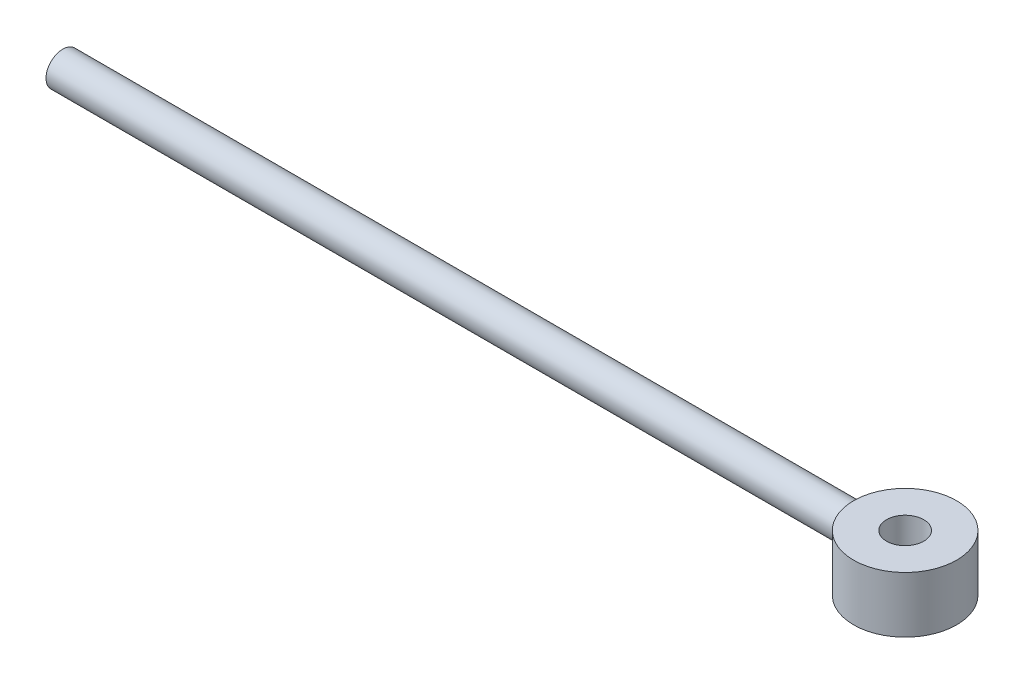
ISO-10303-21;
HEADER;
FILE_DESCRIPTION(('STEP AP214'),'2;1');
FILE_NAME('part.step','',(''),(''),'','','');
FILE_SCHEMA(('AUTOMOTIVE_DESIGN { 1 0 10303 214 1 1 1 1 }'));
ENDSEC;
DATA;
#1=APPLICATION_CONTEXT('core data for automotive mechanical design processes');
#2=APPLICATION_PROTOCOL_DEFINITION('international standard','automotive_design',2000,#1);
#3=PRODUCT_CONTEXT('',#1,'mechanical');
#4=PRODUCT('Part','Part','',(#3));
#5=PRODUCT_RELATED_PRODUCT_CATEGORY('part','',(#4));
#6=PRODUCT_DEFINITION_FORMATION('','',#4);
#7=PRODUCT_DEFINITION_CONTEXT('part definition',#1,'design');
#8=PRODUCT_DEFINITION('design','',#6,#7);
#9=PRODUCT_DEFINITION_SHAPE('','',#8);
#10=(LENGTH_UNIT() NAMED_UNIT(*) SI_UNIT(.MILLI.,.METRE.));
#11=(NAMED_UNIT(*) PLANE_ANGLE_UNIT() SI_UNIT($,.RADIAN.));
#12=(NAMED_UNIT(*) SI_UNIT($,.STERADIAN.) SOLID_ANGLE_UNIT());
#13=UNCERTAINTY_MEASURE_WITH_UNIT(LENGTH_MEASURE(1.E-05),#10,'distance_accuracy_value','');
#14=(GEOMETRIC_REPRESENTATION_CONTEXT(3) GLOBAL_UNCERTAINTY_ASSIGNED_CONTEXT((#13)) GLOBAL_UNIT_ASSIGNED_CONTEXT((#10,
#11,#12)) REPRESENTATION_CONTEXT('',''));
#15=CARTESIAN_POINT('',(0.,0.,0.));
#16=DIRECTION('',(0.,0.,1.));
#17=DIRECTION('',(1.,0.,0.));
#18=AXIS2_PLACEMENT_3D('',#15,#16,#17);
#19=CARTESIAN_POINT('',(30.,0.,0.));
#20=DIRECTION('',(-1.,0.,0.));
#21=DIRECTION('',(0.,0.,1.));
#22=AXIS2_PLACEMENT_3D('',#19,#20,#21);
#23=CYLINDRICAL_SURFACE('',#22,0.6);
#24=CARTESIAN_POINT('',(0.,0.,0.));
#25=DIRECTION('',(1.,0.,0.));
#26=DIRECTION('',(0.,0.,-1.));
#27=AXIS2_PLACEMENT_3D('',#24,#25,#26);
#28=CIRCLE('',#27,0.6);
#29=CARTESIAN_POINT('',(0.,0.,-0.6));
#30=VERTEX_POINT('',#29);
#31=EDGE_CURVE('E43',#30,#30,#28,.T.);
#32=ORIENTED_EDGE('',*,*,#31,.T.);
#33=EDGE_LOOP('',(#32));
#34=FACE_BOUND('',#33,.T.);
#35=CARTESIAN_POINT('',(28.3092314170213,0.,0.6));
#36=CARTESIAN_POINT('',(28.3092314102486,-0.0327232775209698,0.600000021048045));
#37=CARTESIAN_POINT('',(28.3082966765353,-0.065446700652731,0.597313903264607));
#38=CARTESIAN_POINT('',(28.3046771778453,-0.129926791993387,0.5866747785065));
#39=CARTESIAN_POINT('',(28.3019920642428,-0.161683266294539,0.578720722303849));
#40=CARTESIAN_POINT('',(28.2952076497359,-0.223285384870758,0.557852698029514));
#41=CARTESIAN_POINT('',(28.2911110305465,-0.253134526309188,0.544948130185082));
#42=CARTESIAN_POINT('',(28.2819690328196,-0.31025339570937,0.514577258640007));
#43=CARTESIAN_POINT('',(28.2769234585807,-0.337522589865861,0.497110013695926));
#44=CARTESIAN_POINT('',(28.2662397631528,-0.389730533294703,0.457407715108782));
#45=CARTESIAN_POINT('',(28.2605873167459,-0.414558334361539,0.435030585738103));
#46=CARTESIAN_POINT('',(28.2494481198498,-0.460184050835926,0.386447204346545));
#47=CARTESIAN_POINT('',(28.2439613948741,-0.480981348370603,0.360240366312887));
#48=CARTESIAN_POINT('',(28.2336066571032,-0.518454454097597,0.303934869395426));
#49=CARTESIAN_POINT('',(28.2287574625709,-0.535014681932986,0.273755522213586));
#50=CARTESIAN_POINT('',(28.2203924407216,-0.562780077195464,0.210854287067977));
#51=CARTESIAN_POINT('',(28.2168762696466,-0.573986625414937,0.178133057226919));
#52=CARTESIAN_POINT('',(28.2116749161735,-0.590352258994279,0.112239633085704));
#53=CARTESIAN_POINT('',(28.2099323706007,-0.595701261789256,0.0791192195878347));
#54=CARTESIAN_POINT('',(28.2082713284496,-0.600803118325029,0.0124082007359091));
#55=CARTESIAN_POINT('',(28.2083523804334,-0.60055735706881,-0.0211822861921459));
#56=CARTESIAN_POINT('',(28.21029016895,-0.594598627789022,-0.0865382376458059));
#57=CARTESIAN_POINT('',(28.2120799505049,-0.58909180401983,-0.118324804699161));
#58=CARTESIAN_POINT('',(28.2171506103467,-0.573107275646523,-0.180495039455373));
#59=CARTESIAN_POINT('',(28.2204315885553,-0.56262923792993,-0.210878612996319));
#60=CARTESIAN_POINT('',(28.2282027945913,-0.536875340215089,-0.269839452843507));
#61=CARTESIAN_POINT('',(28.2327080289701,-0.52153952028859,-0.298388469337118));
#62=CARTESIAN_POINT('',(28.2424568604807,-0.486554345841618,-0.352569868350041));
#63=CARTESIAN_POINT('',(28.2477006567732,-0.466903827017391,-0.378201460774328));
#64=CARTESIAN_POINT('',(28.2586522251971,-0.422801614956965,-0.427047774792124));
#65=CARTESIAN_POINT('',(28.2643702549741,-0.398172830821582,-0.450100535611627));
#66=CARTESIAN_POINT('',(28.2754240814418,-0.345348534372142,-0.491799660554634));
#67=CARTESIAN_POINT('',(28.2807598240405,-0.317152518866983,-0.510445401960787));
#68=CARTESIAN_POINT('',(28.290499644057,-0.257499713417316,-0.543013185835744));
#69=CARTESIAN_POINT('',(28.2948905131172,-0.22600483947272,-0.556869720617657));
#70=CARTESIAN_POINT('',(28.3020899148639,-0.160949893086272,-0.579029058241223));
#71=CARTESIAN_POINT('',(28.3048990784161,-0.127390649954083,-0.587334075562222));
#72=CARTESIAN_POINT('',(28.3084751606077,-0.0607227625085829,-0.5978307139187));
#73=CARTESIAN_POINT('',(28.3093255558581,-0.0276579572944344,-0.600272416382066));
#74=CARTESIAN_POINT('',(28.3091206299022,0.0384130775009216,-0.599679385787659));
#75=CARTESIAN_POINT('',(28.3080656369801,0.071419316191976,-0.596645596116074));
#76=CARTESIAN_POINT('',(28.3042517578831,0.135319404591377,-0.585412017984289));
#77=CARTESIAN_POINT('',(28.301549332268,0.166247044656946,-0.577383237220481));
#78=CARTESIAN_POINT('',(28.2948064271793,0.226310928378725,-0.55659129422301));
#79=CARTESIAN_POINT('',(28.2907657167069,0.255446861741699,-0.543827314609922));
#80=CARTESIAN_POINT('',(28.2816476727283,0.312091801355309,-0.513480975149149));
#81=CARTESIAN_POINT('',(28.2765423055964,0.339523324230467,-0.495762630749852));
#82=CARTESIAN_POINT('',(28.2659258003756,0.391114447924979,-0.45616617237356));
#83=CARTESIAN_POINT('',(28.260414547667,0.415273118998349,-0.434286880587367));
#84=CARTESIAN_POINT('',(28.2493015809891,0.460776751125034,-0.385797754426249));
#85=CARTESIAN_POINT('',(28.2437073031733,0.481941941850007,-0.359017033452743));
#86=CARTESIAN_POINT('',(28.2333089159438,0.5194880121158,-0.302147127198185));
#87=CARTESIAN_POINT('',(28.2285047753316,0.535869080576285,-0.272058072624152));
#88=CARTESIAN_POINT('',(28.2202522764034,0.563228859626424,-0.209588872765775));
#89=CARTESIAN_POINT('',(28.216794730606,0.574244312696706,-0.177226097310178));
#90=CARTESIAN_POINT('',(28.2115850328241,0.590633906147216,-0.110973028126862));
#91=CARTESIAN_POINT('',(28.2098322930564,0.59600999091971,-0.0770832650937594));
#92=CARTESIAN_POINT('',(28.2082722512031,0.600798885539976,-0.0103859632166944));
#93=CARTESIAN_POINT('',(28.2083805867668,0.600470280930317,0.0224012435012405));
#94=CARTESIAN_POINT('',(28.2103247045988,0.594492783867699,0.0874316923398979));
#95=CARTESIAN_POINT('',(28.212160356232,0.588844293752118,0.119674975409287));
#96=CARTESIAN_POINT('',(28.2173232990608,0.572556739734948,0.182232053308233));
#97=CARTESIAN_POINT('',(28.2206282516411,0.561992307387121,0.212567253589854));
#98=CARTESIAN_POINT('',(28.2283894260166,0.536241232498921,0.271047357489153));
#99=CARTESIAN_POINT('',(28.2328458529201,0.521053766386839,0.299191869723368));
#100=CARTESIAN_POINT('',(28.2426483941191,0.485857701764944,0.353594932760324));
#101=CARTESIAN_POINT('',(28.2480207494116,0.465695305518078,0.37974919768473));
#102=CARTESIAN_POINT('',(28.2589819743838,0.42138652785955,0.428388056261741));
#103=CARTESIAN_POINT('',(28.2645709112859,0.397238901814637,0.45087149909653));
#104=CARTESIAN_POINT('',(28.2755808745118,0.344573022196982,0.492376366358855));
#105=CARTESIAN_POINT('',(28.2809879786996,0.315925855444203,0.511238403601778));
#106=CARTESIAN_POINT('',(28.2907638045233,0.255701605043558,0.543864457229267));
#107=CARTESIAN_POINT('',(28.2951328488636,0.224125436197413,0.557630058700569));
#108=CARTESIAN_POINT('',(28.3020682961183,0.160835032580363,0.578947926600826));
#109=CARTESIAN_POINT('',(28.304725462695,0.129237712862003,0.586817494434358));
#110=CARTESIAN_POINT('',(28.308306758675,0.0650934456508719,0.597342714853901));
#111=CARTESIAN_POINT('',(28.3092314237575,0.0325467948476434,0.599999979065471));
#112=CARTESIAN_POINT('',(28.3092314170213,0.,0.6));
#113=B_SPLINE_CURVE_WITH_KNOTS('',3,(#35,#36,#37,#38,#39,#40,#41,#42,#43,#44,#45,#46,#47,#48,
#49,#50,#51,#52,#53,#54,#55,#56,#57,#58,#59,#60,#61,#62,#63,#64,#65,#66,#67,#68,#69,#70,#71,#72,
#73,#74,#75,#76,#77,#78,#79,#80,#81,#82,#83,#84,#85,#86,#87,#88,#89,#90,#91,#92,#93,#94,#95,#96,
#97,#98,#99,#100,#101,#102,#103,#104,#105,#106,#107,#108,#109,#110,#111,#112),.UNSPECIFIED.,.T.,
.F.,(4,2,2,2,2,2,2,2,2,2,2,2,2,2,2,2,2,2,2,2,2,2,2,2,2,2,2,2,2,2,2,2,2,2,2,2,2,2,4),(0.,
0.0980494076578159,0.196118349927552,0.294001989434819,0.391905837515363,0.493142857691484,
0.594395385164478,0.698170293036162,0.80191842136999,0.902192868171572,1.00244249196074,
1.09891852977005,1.19540103318557,1.29312414792071,1.39087366531563,1.49304872303886,
1.59523820960576,1.69877475618055,1.80226997773292,1.90126577072852,2.00024450912035,
2.09600813095541,2.19178829098998,2.29051104340805,2.3892617822654,2.49253974809211,
2.59581363503521,2.69837002112577,2.80089103526621,2.8987775554052,2.99665667308343,
3.09309602747312,3.18955257214446,3.28947948062592,3.38943765669808,3.49310427849467,
3.59673863089542,3.69428940711409,3.79181001622566),.UNSPECIFIED.);
#114=CARTESIAN_POINT('',(28.3092314170213,0.,0.6));
#115=VERTEX_POINT('',#114);
#116=EDGE_CURVE('E10',#115,#115,#113,.T.);
#117=ORIENTED_EDGE('',*,*,#116,.F.);
#118=EDGE_LOOP('',(#117));
#119=FACE_BOUND('',#118,.T.);
#120=ADVANCED_FACE('F33',(#34,#119),#23,.T.);
#121=CARTESIAN_POINT('',(0.,0.,0.));
#122=DIRECTION('',(1.,0.,0.));
#123=DIRECTION('',(0.,0.,-1.));
#124=AXIS2_PLACEMENT_3D('',#121,#122,#123);
#125=PLANE('',#124);
#126=ORIENTED_EDGE('',*,*,#31,.F.);
#127=EDGE_LOOP('',(#126));
#128=FACE_BOUND('',#127,.T.);
#129=ADVANCED_FACE('F81',(#128),#125,.F.);
#130=CARTESIAN_POINT('',(30.0463794012655,0.754265734053775,0.));
#131=DIRECTION('',(0.,-1.,0.));
#132=DIRECTION('',(0.,0.,-1.));
#133=AXIS2_PLACEMENT_3D('',#130,#131,#132);
#134=CYLINDRICAL_SURFACE('',#133,1.83784741454883);
#135=CARTESIAN_POINT('',(30.0463794012655,-1.24573426594622,0.));
#136=DIRECTION('',(0.,1.,0.));
#137=DIRECTION('',(0.,0.,1.));
#138=AXIS2_PLACEMENT_3D('',#135,#136,#137);
#139=CIRCLE('',#138,1.83784741454883);
#140=CARTESIAN_POINT('',(30.0463794012655,-1.24573426594622,1.83784741454883));
#141=VERTEX_POINT('',#140);
#142=EDGE_CURVE('E51',#141,#141,#139,.T.);
#143=ORIENTED_EDGE('',*,*,#142,.T.);
#144=EDGE_LOOP('',(#143));
#145=FACE_BOUND('',#144,.T.);
#146=CARTESIAN_POINT('',(30.0463794012655,0.754265734053775,0.));
#147=DIRECTION('',(0.,1.,0.));
#148=DIRECTION('',(0.,0.,1.));
#149=AXIS2_PLACEMENT_3D('',#146,#147,#148);
#150=CIRCLE('',#149,1.83784741454883);
#151=CARTESIAN_POINT('',(30.0463794012655,0.754265734053775,1.83784741454883));
#152=VERTEX_POINT('',#151);
#153=EDGE_CURVE('E47',#152,#152,#150,.T.);
#154=ORIENTED_EDGE('',*,*,#153,.F.);
#155=EDGE_LOOP('',(#154));
#156=FACE_BOUND('',#155,.T.);
#157=ORIENTED_EDGE('',*,*,#116,.T.);
#158=EDGE_LOOP('',(#157));
#159=FACE_BOUND('',#158,.T.);
#160=ADVANCED_FACE('F78',(#145,#156,#159),#134,.T.);
#161=CARTESIAN_POINT('',(30.0463794012655,0.754265734053775,0.));
#162=DIRECTION('',(0.,1.,0.));
#163=DIRECTION('',(0.,0.,1.));
#164=AXIS2_PLACEMENT_3D('',#161,#162,#163);
#165=PLANE('',#164);
#166=CARTESIAN_POINT('',(30.0463794012655,0.754265734053775,0.));
#167=DIRECTION('',(0.,-1.,0.));
#168=DIRECTION('',(0.,0.,-1.));
#169=AXIS2_PLACEMENT_3D('',#166,#167,#168);
#170=CIRCLE('',#169,0.665703361078994);
#171=CARTESIAN_POINT('',(30.0463794012655,0.754265734053775,-0.665703361078994));
#172=VERTEX_POINT('',#171);
#173=EDGE_CURVE('E55',#172,#172,#170,.T.);
#174=ORIENTED_EDGE('',*,*,#173,.T.);
#175=EDGE_LOOP('',(#174));
#176=FACE_BOUND('',#175,.T.);
#177=ORIENTED_EDGE('',*,*,#153,.T.);
#178=EDGE_LOOP('',(#177));
#179=FACE_BOUND('',#178,.T.);
#180=ADVANCED_FACE('F63',(#176,#179),#165,.T.);
#181=CARTESIAN_POINT('',(30.0463794012655,-1.24573426594622,0.));
#182=DIRECTION('',(0.,1.,0.));
#183=DIRECTION('',(0.,0.,1.));
#184=AXIS2_PLACEMENT_3D('',#181,#182,#183);
#185=PLANE('',#184);
#186=CARTESIAN_POINT('',(30.0463794012655,-1.24573426594622,0.));
#187=DIRECTION('',(0.,-1.,0.));
#188=DIRECTION('',(0.,0.,-1.));
#189=AXIS2_PLACEMENT_3D('',#186,#187,#188);
#190=CIRCLE('',#189,0.665703361078994);
#191=CARTESIAN_POINT('',(30.0463794012655,-1.24573426594622,-0.665703361078994));
#192=VERTEX_POINT('',#191);
#193=EDGE_CURVE('E57',#192,#192,#190,.T.);
#194=ORIENTED_EDGE('',*,*,#193,.F.);
#195=EDGE_LOOP('',(#194));
#196=FACE_BOUND('',#195,.T.);
#197=ORIENTED_EDGE('',*,*,#142,.F.);
#198=EDGE_LOOP('',(#197));
#199=FACE_BOUND('',#198,.T.);
#200=ADVANCED_FACE('F69',(#196,#199),#185,.F.);
#201=CARTESIAN_POINT('',(30.0463794012655,0.754265734053775,0.));
#202=DIRECTION('',(0.,-1.,0.));
#203=DIRECTION('',(0.,0.,-1.));
#204=AXIS2_PLACEMENT_3D('',#201,#202,#203);
#205=CYLINDRICAL_SURFACE('',#204,0.665703361078994);
#206=ORIENTED_EDGE('',*,*,#173,.F.);
#207=EDGE_LOOP('',(#206));
#208=FACE_BOUND('',#207,.T.);
#209=ORIENTED_EDGE('',*,*,#193,.T.);
#210=EDGE_LOOP('',(#209));
#211=FACE_BOUND('',#210,.T.);
#212=ADVANCED_FACE('F66',(#208,#211),#205,.F.);
#213=CLOSED_SHELL('',(#120,#129,#160,#180,#200,#212));
#214=MANIFOLD_SOLID_BREP('B2',#213);
#215=ADVANCED_BREP_SHAPE_REPRESENTATION('',(#18,#214),#14);
#216=SHAPE_DEFINITION_REPRESENTATION(#9,#215);
ENDSEC;
END-ISO-10303-21;
